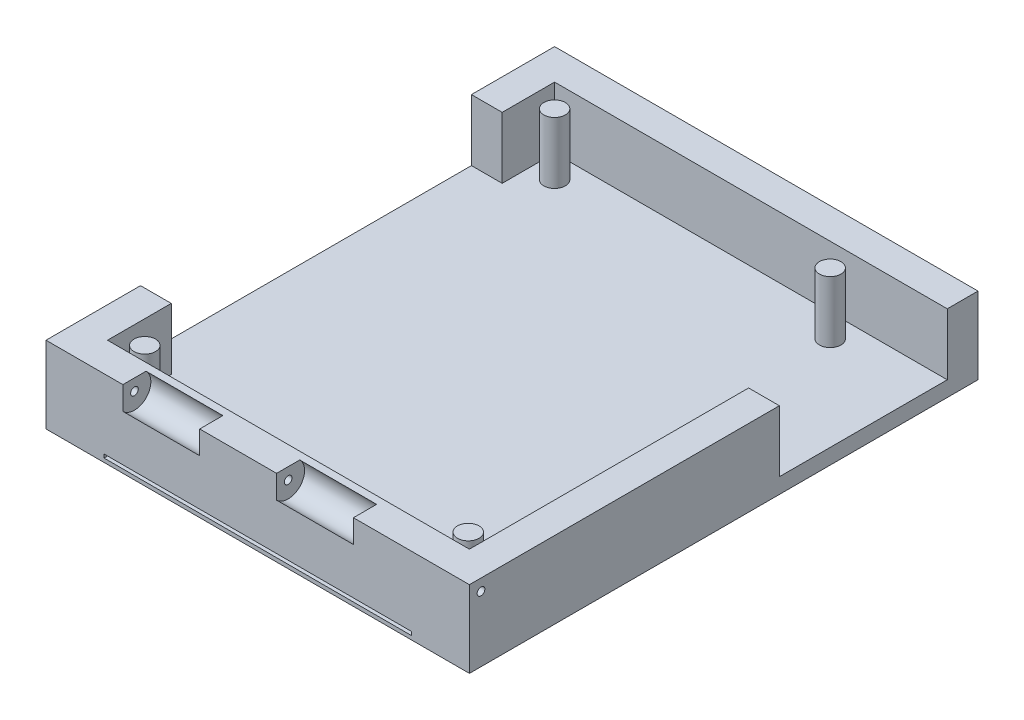
ISO-10303-21;
HEADER;
FILE_DESCRIPTION(('STEP AP214'),'2;1');
FILE_NAME('part.step','',(''),(''),'','','');
FILE_SCHEMA(('AUTOMOTIVE_DESIGN { 1 0 10303 214 1 1 1 1 }'));
ENDSEC;
DATA;
#1=APPLICATION_CONTEXT('core data for automotive mechanical design processes');
#2=APPLICATION_PROTOCOL_DEFINITION('international standard','automotive_design',2000,#1);
#3=PRODUCT_CONTEXT('',#1,'mechanical');
#4=PRODUCT('Part','Part','',(#3));
#5=PRODUCT_RELATED_PRODUCT_CATEGORY('part','',(#4));
#6=PRODUCT_DEFINITION_FORMATION('','',#4);
#7=PRODUCT_DEFINITION_CONTEXT('part definition',#1,'design');
#8=PRODUCT_DEFINITION('design','',#6,#7);
#9=PRODUCT_DEFINITION_SHAPE('','',#8);
#10=(LENGTH_UNIT() NAMED_UNIT(*) SI_UNIT(.MILLI.,.METRE.));
#11=(NAMED_UNIT(*) PLANE_ANGLE_UNIT() SI_UNIT($,.RADIAN.));
#12=(NAMED_UNIT(*) SI_UNIT($,.STERADIAN.) SOLID_ANGLE_UNIT());
#13=UNCERTAINTY_MEASURE_WITH_UNIT(LENGTH_MEASURE(1.E-05),#10,'distance_accuracy_value','');
#14=(GEOMETRIC_REPRESENTATION_CONTEXT(3) GLOBAL_UNCERTAINTY_ASSIGNED_CONTEXT((#13)) GLOBAL_UNIT_ASSIGNED_CONTEXT((#10,
#11,#12)) REPRESENTATION_CONTEXT('',''));
#15=CARTESIAN_POINT('',(0.,0.,0.));
#16=DIRECTION('',(0.,0.,1.));
#17=DIRECTION('',(1.,0.,0.));
#18=AXIS2_PLACEMENT_3D('',#15,#16,#17);
#19=CARTESIAN_POINT('',(0.,10.,-4.));
#20=DIRECTION('',(0.,0.,-1.));
#21=DIRECTION('',(-1.,0.,0.));
#22=AXIS2_PLACEMENT_3D('',#19,#20,#21);
#23=PLANE('',#22);
#24=DIRECTION('',(0.,-1.,0.));
#25=VECTOR('',#24,1.);
#26=CARTESIAN_POINT('',(43.54,0.,-4.00000000000001));
#27=LINE('',#26,#25);
#28=CARTESIAN_POINT('',(43.54,0.960570004327368,-4.00000000000001));
#29=VERTEX_POINT('',#28);
#30=CARTESIAN_POINT('',(43.54,0.496763339663532,-4.00000000000001));
#31=VERTEX_POINT('',#30);
#32=EDGE_CURVE('E65',#29,#31,#27,.T.);
#33=ORIENTED_EDGE('',*,*,#32,.F.);
#34=DIRECTION('',(1.,0.,0.));
#35=VECTOR('',#34,1.);
#36=CARTESIAN_POINT('',(0.,0.960570004327371,-4.));
#37=LINE('',#36,#35);
#38=CARTESIAN_POINT('',(3.55,0.96057000432737,-4.));
#39=VERTEX_POINT('',#38);
#40=EDGE_CURVE('E256',#39,#29,#37,.T.);
#41=ORIENTED_EDGE('',*,*,#40,.F.);
#42=DIRECTION('',(0.,1.,0.));
#43=VECTOR('',#42,1.);
#44=CARTESIAN_POINT('',(3.55,0.,-4.));
#45=LINE('',#44,#43);
#46=CARTESIAN_POINT('',(3.55,0.496763339663532,-4.));
#47=VERTEX_POINT('',#46);
#48=EDGE_CURVE('E260',#47,#39,#45,.T.);
#49=ORIENTED_EDGE('',*,*,#48,.F.);
#50=DIRECTION('',(-1.,0.,0.));
#51=VECTOR('',#50,1.);
#52=CARTESIAN_POINT('',(0.,0.496763339663532,-4.));
#53=LINE('',#52,#51);
#54=EDGE_CURVE('E269',#31,#47,#53,.T.);
#55=ORIENTED_EDGE('',*,*,#54,.F.);
#56=EDGE_LOOP('',(#33,#41,#49,#55));
#57=FACE_BOUND('',#56,.T.);
#58=DIRECTION('',(1.,0.,0.));
#59=VECTOR('',#58,1.);
#60=CARTESIAN_POINT('',(0.,0.,-4.));
#61=LINE('',#60,#59);
#62=CARTESIAN_POINT('',(-4.,0.,-4.));
#63=VERTEX_POINT('',#62);
#64=CARTESIAN_POINT('',(51.09,0.,-4.00000000000002));
#65=VERTEX_POINT('',#64);
#66=EDGE_CURVE('E486',#63,#65,#61,.T.);
#67=ORIENTED_EDGE('',*,*,#66,.F.);
#68=DIRECTION('',(0.,-1.,0.));
#69=VECTOR('',#68,1.);
#70=CARTESIAN_POINT('',(-4.,10.,-4.));
#71=LINE('',#70,#69);
#72=CARTESIAN_POINT('',(-4.,10.,-4.));
#73=VERTEX_POINT('',#72);
#74=EDGE_CURVE('E509',#73,#63,#71,.T.);
#75=ORIENTED_EDGE('',*,*,#74,.F.);
#76=DIRECTION('',(1.,0.,0.));
#77=VECTOR('',#76,1.);
#78=CARTESIAN_POINT('',(0.,10.,-4.));
#79=LINE('',#78,#77);
#80=CARTESIAN_POINT('',(51.09,10.,-4.00000000000002));
#81=VERTEX_POINT('',#80);
#82=EDGE_CURVE('E454',#73,#81,#79,.T.);
#83=ORIENTED_EDGE('',*,*,#82,.T.);
#84=DIRECTION('',(0.,-1.,0.));
#85=VECTOR('',#84,1.);
#86=CARTESIAN_POINT('',(51.09,10.,-4.00000000000002));
#87=LINE('',#86,#85);
#88=EDGE_CURVE('E512',#81,#65,#87,.T.);
#89=ORIENTED_EDGE('',*,*,#88,.T.);
#90=EDGE_LOOP('',(#67,#75,#83,#89));
#91=FACE_BOUND('',#90,.T.);
#92=DIRECTION('',(-1.,0.,0.));
#93=VECTOR('',#92,1.);
#94=CARTESIAN_POINT('',(0.,6.47627060246801,-4.));
#95=LINE('',#94,#93);
#96=CARTESIAN_POINT('',(28.54,6.47627060246801,-4.00000000000001));
#97=VERTEX_POINT('',#96);
#98=CARTESIAN_POINT('',(18.54,6.47627060246801,-4.00000000000001));
#99=VERTEX_POINT('',#98);
#100=EDGE_CURVE('E304',#97,#99,#95,.T.);
#101=ORIENTED_EDGE('',*,*,#100,.F.);
#102=DIRECTION('',(0.,-1.,0.));
#103=VECTOR('',#102,1.);
#104=CARTESIAN_POINT('',(28.54,0.,-4.00000000000001));
#105=LINE('',#104,#103);
#106=CARTESIAN_POINT('',(28.54,7.51319703194659,-4.00000000000001));
#107=VERTEX_POINT('',#106);
#108=EDGE_CURVE('E278',#107,#97,#105,.T.);
#109=ORIENTED_EDGE('',*,*,#108,.F.);
#110=DIRECTION('',(-1.,0.,0.));
#111=VECTOR('',#110,1.);
#112=CARTESIAN_POINT('',(0.,7.51319703194659,-4.));
#113=LINE('',#112,#111);
#114=CARTESIAN_POINT('',(18.54,7.51319703194659,-4.00000000000001));
#115=VERTEX_POINT('',#114);
#116=EDGE_CURVE('E289',#107,#115,#113,.T.);
#117=ORIENTED_EDGE('',*,*,#116,.T.);
#118=DIRECTION('',(0.,-1.,0.));
#119=VECTOR('',#118,1.);
#120=CARTESIAN_POINT('',(18.54,0.,-4.00000000000001));
#121=LINE('',#120,#119);
#122=EDGE_CURVE('E308',#115,#99,#121,.T.);
#123=ORIENTED_EDGE('',*,*,#122,.T.);
#124=EDGE_LOOP('',(#101,#109,#117,#123));
#125=FACE_BOUND('',#124,.T.);
#126=ADVANCED_FACE('F49',(#57,#91,#125),#23,.T.);
#127=CARTESIAN_POINT('',(-4.,8.48912292740961,60.6623709498255));
#128=DIRECTION('',(1.,0.,0.));
#129=DIRECTION('',(0.,0.,-1.));
#130=AXIS2_PLACEMENT_3D('',#127,#128,#129);
#131=CYLINDRICAL_SURFACE('',#130,0.499999999999999);
#132=CARTESIAN_POINT('',(16.,8.48912292740961,60.6623709498255));
#133=DIRECTION('',(1.,0.,0.));
#134=DIRECTION('',(0.,0.,-1.));
#135=AXIS2_PLACEMENT_3D('',#132,#133,#134);
#136=CIRCLE('',#135,0.499999999999999);
#137=CARTESIAN_POINT('',(16.,8.48912292740961,60.1623709498255));
#138=VERTEX_POINT('',#137);
#139=EDGE_CURVE('E369',#138,#138,#136,.F.);
#140=ORIENTED_EDGE('',*,*,#139,.T.);
#141=EDGE_LOOP('',(#140));
#142=FACE_BOUND('',#141,.T.);
#143=CARTESIAN_POINT('',(26.,8.48912292740961,60.6623709498255));
#144=DIRECTION('',(1.,0.,0.));
#145=DIRECTION('',(0.,0.,-1.));
#146=AXIS2_PLACEMENT_3D('',#143,#144,#145);
#147=CIRCLE('',#146,0.499999999999999);
#148=CARTESIAN_POINT('',(26.,8.48912292740961,60.1623709498255));
#149=VERTEX_POINT('',#148);
#150=EDGE_CURVE('E333',#149,#149,#147,.F.);
#151=ORIENTED_EDGE('',*,*,#150,.F.);
#152=EDGE_LOOP('',(#151));
#153=FACE_BOUND('',#152,.T.);
#154=ADVANCED_FACE('F671',(#142,#153),#131,.F.);
#155=CARTESIAN_POINT('',(-4.,8.48912292740961,60.6623709498255));
#156=DIRECTION('',(1.,0.,0.));
#157=DIRECTION('',(0.,0.,-1.));
#158=AXIS2_PLACEMENT_3D('',#155,#156,#157);
#159=CIRCLE('',#158,0.499999999999999);
#160=CARTESIAN_POINT('',(-4.,8.48912292740961,60.1623709498255));
#161=VERTEX_POINT('',#160);
#162=EDGE_CURVE('E381',#161,#161,#159,.T.);
#163=ORIENTED_EDGE('',*,*,#162,.F.);
#164=EDGE_LOOP('',(#163));
#165=FACE_BOUND('',#164,.T.);
#166=CARTESIAN_POINT('',(6.00000000000001,8.48912292740961,60.6623709498255));
#167=DIRECTION('',(1.,0.,0.));
#168=DIRECTION('',(0.,0.,-1.));
#169=AXIS2_PLACEMENT_3D('',#166,#167,#168);
#170=CIRCLE('',#169,0.499999999999999);
#171=CARTESIAN_POINT('',(6.00000000000001,8.48912292740961,60.1623709498255));
#172=VERTEX_POINT('',#171);
#173=EDGE_CURVE('E359',#172,#172,#170,.F.);
#174=ORIENTED_EDGE('',*,*,#173,.F.);
#175=EDGE_LOOP('',(#174));
#176=FACE_BOUND('',#175,.T.);
#177=ADVANCED_FACE('F679',(#165,#176),#131,.F.);
#178=CARTESIAN_POINT('',(0.,10.,0.));
#179=DIRECTION('',(1.,0.,0.));
#180=DIRECTION('',(0.,0.,-1.));
#181=AXIS2_PLACEMENT_3D('',#178,#179,#180);
#182=PLANE('',#181);
#183=DIRECTION('',(0.,0.,1.));
#184=VECTOR('',#183,1.);
#185=CARTESIAN_POINT('',(0.,10.,0.));
#186=LINE('',#185,#184);
#187=CARTESIAN_POINT('',(0.,10.,0.));
#188=VERTEX_POINT('',#187);
#189=CARTESIAN_POINT('',(0.,10.,6.81881241842648));
#190=VERTEX_POINT('',#189);
#191=EDGE_CURVE('E471',#188,#190,#186,.T.);
#192=ORIENTED_EDGE('',*,*,#191,.T.);
#193=DIRECTION('',(0.,-1.,0.));
#194=VECTOR('',#193,1.);
#195=CARTESIAN_POINT('',(0.,10.,6.81881241842648));
#196=LINE('',#195,#194);
#197=CARTESIAN_POINT('',(0.,2.,6.81881241842648));
#198=VERTEX_POINT('',#197);
#199=EDGE_CURVE('E412',#190,#198,#196,.T.);
#200=ORIENTED_EDGE('',*,*,#199,.T.);
#201=DIRECTION('',(0.,0.,1.));
#202=VECTOR('',#201,1.);
#203=CARTESIAN_POINT('',(0.,2.,0.));
#204=LINE('',#203,#202);
#205=CARTESIAN_POINT('',(0.,2.,0.));
#206=VERTEX_POINT('',#205);
#207=EDGE_CURVE('E537',#206,#198,#204,.T.);
#208=ORIENTED_EDGE('',*,*,#207,.F.);
#209=DIRECTION('',(0.,-1.,0.));
#210=VECTOR('',#209,1.);
#211=CARTESIAN_POINT('',(0.,10.,0.));
#212=LINE('',#211,#210);
#213=EDGE_CURVE('E493',#188,#206,#212,.T.);
#214=ORIENTED_EDGE('',*,*,#213,.F.);
#215=EDGE_LOOP('',(#192,#200,#208,#214));
#216=FACE_BOUND('',#215,.T.);
#217=ADVANCED_FACE('F647',(#216),#182,.T.);
#218=CARTESIAN_POINT('',(0.,10.,0.));
#219=DIRECTION('',(0.,1.,0.));
#220=DIRECTION('',(0.,0.,1.));
#221=AXIS2_PLACEMENT_3D('',#218,#219,#220);
#222=PLANE('',#221);
#223=DIRECTION('',(0.,0.,1.));
#224=VECTOR('',#223,1.);
#225=CARTESIAN_POINT('',(-4.,10.,0.));
#226=LINE('',#225,#224);
#227=CARTESIAN_POINT('',(-4.,10.,6.81881241842648));
#228=VERTEX_POINT('',#227);
#229=EDGE_CURVE('E459',#73,#228,#226,.T.);
#230=ORIENTED_EDGE('',*,*,#229,.T.);
#231=DIRECTION('',(1.,0.,0.));
#232=VECTOR('',#231,1.);
#233=CARTESIAN_POINT('',(-4.,10.,6.81881241842648));
#234=LINE('',#233,#232);
#235=EDGE_CURVE('E394',#228,#190,#234,.T.);
#236=ORIENTED_EDGE('',*,*,#235,.T.);
#237=ORIENTED_EDGE('',*,*,#191,.F.);
#238=DIRECTION('',(1.,0.,0.));
#239=VECTOR('',#238,1.);
#240=CARTESIAN_POINT('',(0.,10.,0.));
#241=LINE('',#240,#239);
#242=CARTESIAN_POINT('',(51.09,10.,0.));
#243=VERTEX_POINT('',#242);
#244=EDGE_CURVE('E475',#188,#243,#241,.T.);
#245=ORIENTED_EDGE('',*,*,#244,.T.);
#246=DIRECTION('',(0.,0.,1.));
#247=VECTOR('',#246,1.);
#248=CARTESIAN_POINT('',(51.09,10.,0.));
#249=LINE('',#248,#247);
#250=EDGE_CURVE('E450',#81,#243,#249,.T.);
#251=ORIENTED_EDGE('',*,*,#250,.F.);
#252=ORIENTED_EDGE('',*,*,#82,.F.);
#253=EDGE_LOOP('',(#230,#236,#237,#245,#251,#252));
#254=FACE_BOUND('',#253,.T.);
#255=ADVANCED_FACE('F651',(#254),#222,.T.);
#256=CARTESIAN_POINT('',(0.,2.,0.));
#257=DIRECTION('',(0.,-1.,0.));
#258=DIRECTION('',(0.,0.,-1.));
#259=AXIS2_PLACEMENT_3D('',#256,#257,#258);
#260=PLANE('',#259);
#261=DIRECTION('',(1.,0.,0.));
#262=VECTOR('',#261,1.);
#263=CARTESIAN_POINT('',(-3.99999999999999,2.,49.872624267247));
#264=LINE('',#263,#262);
#265=CARTESIAN_POINT('',(-3.99999999999999,2.,49.872624267247));
#266=VERTEX_POINT('',#265);
#267=CARTESIAN_POINT('',(0.,2.,49.872624267247));
#268=VERTEX_POINT('',#267);
#269=EDGE_CURVE('E389',#266,#268,#264,.T.);
#270=ORIENTED_EDGE('',*,*,#269,.T.);
#271=CARTESIAN_POINT('',(0.,2.,58.17));
#272=VERTEX_POINT('',#271);
#273=EDGE_CURVE('E536',#268,#272,#204,.T.);
#274=ORIENTED_EDGE('',*,*,#273,.T.);
#275=DIRECTION('',(1.,0.,0.));
#276=VECTOR('',#275,1.);
#277=CARTESIAN_POINT('',(0.,2.,58.17));
#278=LINE('',#277,#276);
#279=CARTESIAN_POINT('',(47.09,2.,58.17));
#280=VERTEX_POINT('',#279);
#281=EDGE_CURVE('E541',#272,#280,#278,.T.);
#282=ORIENTED_EDGE('',*,*,#281,.T.);
#283=DIRECTION('',(0.,0.,-1.));
#284=VECTOR('',#283,1.);
#285=CARTESIAN_POINT('',(47.09,2.,0.));
#286=LINE('',#285,#284);
#287=CARTESIAN_POINT('',(47.09,2.,21.843851608234));
#288=VERTEX_POINT('',#287);
#289=EDGE_CURVE('E545',#280,#288,#286,.T.);
#290=ORIENTED_EDGE('',*,*,#289,.T.);
#291=DIRECTION('',(1.,0.,0.));
#292=VECTOR('',#291,1.);
#293=CARTESIAN_POINT('',(47.09,2.,21.843851608234));
#294=LINE('',#293,#292);
#295=CARTESIAN_POINT('',(51.09,2.,21.843851608234));
#296=VERTEX_POINT('',#295);
#297=EDGE_CURVE('E426',#288,#296,#294,.T.);
#298=ORIENTED_EDGE('',*,*,#297,.T.);
#299=DIRECTION('',(0.,0.,1.));
#300=VECTOR('',#299,1.);
#301=CARTESIAN_POINT('',(51.09,2.,0.));
#302=LINE('',#301,#300);
#303=CARTESIAN_POINT('',(51.09,2.,0.));
#304=VERTEX_POINT('',#303);
#305=EDGE_CURVE('E429',#304,#296,#302,.T.);
#306=ORIENTED_EDGE('',*,*,#305,.F.);
#307=DIRECTION('',(-1.,0.,0.));
#308=VECTOR('',#307,1.);
#309=CARTESIAN_POINT('',(0.,2.,0.));
#310=LINE('',#309,#308);
#311=EDGE_CURVE('E532',#304,#206,#310,.T.);
#312=ORIENTED_EDGE('',*,*,#311,.T.);
#313=ORIENTED_EDGE('',*,*,#207,.T.);
#314=DIRECTION('',(1.,0.,0.));
#315=VECTOR('',#314,1.);
#316=CARTESIAN_POINT('',(-4.,2.,6.81881241842648));
#317=LINE('',#316,#315);
#318=CARTESIAN_POINT('',(-4.,2.,6.81881241842648));
#319=VERTEX_POINT('',#318);
#320=EDGE_CURVE('E393',#319,#198,#317,.T.);
#321=ORIENTED_EDGE('',*,*,#320,.F.);
#322=DIRECTION('',(0.,0.,1.));
#323=VECTOR('',#322,1.);
#324=CARTESIAN_POINT('',(-4.,2.,6.81881241842648));
#325=LINE('',#324,#323);
#326=EDGE_CURVE('E397',#319,#266,#325,.T.);
#327=ORIENTED_EDGE('',*,*,#326,.T.);
#328=EDGE_LOOP('',(#270,#274,#282,#290,#298,#306,#312,#313,#321,#327));
#329=FACE_BOUND('',#328,.T.);
#330=CARTESIAN_POINT('',(3.,2.,3.));
#331=DIRECTION('',(0.,-1.,0.));
#332=DIRECTION('',(0.,0.,-1.));
#333=AXIS2_PLACEMENT_3D('',#330,#331,#332);
#334=CIRCLE('',#333,1.4);
#335=CARTESIAN_POINT('',(3.,2.,1.6));
#336=VERTEX_POINT('',#335);
#337=EDGE_CURVE('E561',#336,#336,#334,.F.);
#338=ORIENTED_EDGE('',*,*,#337,.F.);
#339=EDGE_LOOP('',(#338));
#340=FACE_BOUND('',#339,.T.);
#341=CARTESIAN_POINT('',(38.86,2.,3.));
#342=DIRECTION('',(0.,-1.,0.));
#343=DIRECTION('',(0.,0.,-1.));
#344=AXIS2_PLACEMENT_3D('',#341,#342,#343);
#345=CIRCLE('',#344,1.4);
#346=CARTESIAN_POINT('',(38.86,2.,1.6));
#347=VERTEX_POINT('',#346);
#348=EDGE_CURVE('E557',#347,#347,#345,.F.);
#349=ORIENTED_EDGE('',*,*,#348,.F.);
#350=EDGE_LOOP('',(#349));
#351=FACE_BOUND('',#350,.T.);
#352=CARTESIAN_POINT('',(45.09,2.,56.32));
#353=DIRECTION('',(0.,-1.,0.));
#354=DIRECTION('',(0.,0.,-1.));
#355=AXIS2_PLACEMENT_3D('',#352,#353,#354);
#356=CIRCLE('',#355,1.4);
#357=CARTESIAN_POINT('',(45.09,2.,54.92));
#358=VERTEX_POINT('',#357);
#359=EDGE_CURVE('E553',#358,#358,#356,.F.);
#360=ORIENTED_EDGE('',*,*,#359,.F.);
#361=EDGE_LOOP('',(#360));
#362=FACE_BOUND('',#361,.T.);
#363=CARTESIAN_POINT('',(3.00000000000001,2.,56.32));
#364=DIRECTION('',(0.,-1.,0.));
#365=DIRECTION('',(0.,0.,-1.));
#366=AXIS2_PLACEMENT_3D('',#363,#364,#365);
#367=CIRCLE('',#366,1.4);
#368=CARTESIAN_POINT('',(3.00000000000001,2.,54.92));
#369=VERTEX_POINT('',#368);
#370=EDGE_CURVE('E549',#369,#369,#367,.F.);
#371=ORIENTED_EDGE('',*,*,#370,.F.);
#372=EDGE_LOOP('',(#371));
#373=FACE_BOUND('',#372,.T.);
#374=ADVANCED_FACE('F615',(#329,#340,#351,#362,#373),#260,.F.);
#375=CARTESIAN_POINT('',(3.00000000000001,10.,56.32));
#376=DIRECTION('',(0.,-1.,0.));
#377=DIRECTION('',(0.,0.,-1.));
#378=AXIS2_PLACEMENT_3D('',#375,#376,#377);
#379=CYLINDRICAL_SURFACE('',#378,1.4);
#380=CARTESIAN_POINT('',(3.00000000000001,10.,56.32));
#381=DIRECTION('',(0.,1.,0.));
#382=DIRECTION('',(0.,0.,1.));
#383=AXIS2_PLACEMENT_3D('',#380,#381,#382);
#384=CIRCLE('',#383,1.4);
#385=CARTESIAN_POINT('',(3.00000000000001,10.,57.72));
#386=VERTEX_POINT('',#385);
#387=EDGE_CURVE('E528',#386,#386,#384,.T.);
#388=ORIENTED_EDGE('',*,*,#387,.F.);
#389=EDGE_LOOP('',(#388));
#390=FACE_BOUND('',#389,.T.);
#391=ORIENTED_EDGE('',*,*,#370,.T.);
#392=EDGE_LOOP('',(#391));
#393=FACE_BOUND('',#392,.T.);
#394=ADVANCED_FACE('F717',(#390,#393),#379,.T.);
#395=CARTESIAN_POINT('',(0.,10.,0.));
#396=DIRECTION('',(0.,1.,0.));
#397=DIRECTION('',(0.,0.,1.));
#398=AXIS2_PLACEMENT_3D('',#395,#396,#397);
#399=PLANE('',#398);
#400=ORIENTED_EDGE('',*,*,#387,.T.);
#401=EDGE_LOOP('',(#400));
#402=FACE_BOUND('',#401,.T.);
#403=ADVANCED_FACE('F710',(#402),#399,.T.);
#404=CARTESIAN_POINT('',(45.09,10.,56.32));
#405=DIRECTION('',(0.,-1.,0.));
#406=DIRECTION('',(0.,0.,-1.));
#407=AXIS2_PLACEMENT_3D('',#404,#405,#406);
#408=CYLINDRICAL_SURFACE('',#407,1.4);
#409=CARTESIAN_POINT('',(45.09,10.,56.32));
#410=DIRECTION('',(0.,1.,0.));
#411=DIRECTION('',(0.,0.,1.));
#412=AXIS2_PLACEMENT_3D('',#409,#410,#411);
#413=CIRCLE('',#412,1.4);
#414=CARTESIAN_POINT('',(45.09,10.,57.72));
#415=VERTEX_POINT('',#414);
#416=EDGE_CURVE('E524',#415,#415,#413,.T.);
#417=ORIENTED_EDGE('',*,*,#416,.F.);
#418=EDGE_LOOP('',(#417));
#419=FACE_BOUND('',#418,.T.);
#420=ORIENTED_EDGE('',*,*,#359,.T.);
#421=EDGE_LOOP('',(#420));
#422=FACE_BOUND('',#421,.T.);
#423=ADVANCED_FACE('F707',(#419,#422),#408,.T.);
#424=CARTESIAN_POINT('',(0.,10.,0.));
#425=DIRECTION('',(0.,1.,0.));
#426=DIRECTION('',(0.,0.,1.));
#427=AXIS2_PLACEMENT_3D('',#424,#425,#426);
#428=PLANE('',#427);
#429=ORIENTED_EDGE('',*,*,#416,.T.);
#430=EDGE_LOOP('',(#429));
#431=FACE_BOUND('',#430,.T.);
#432=ADVANCED_FACE('F702',(#431),#428,.T.);
#433=CARTESIAN_POINT('',(38.86,10.,3.));
#434=DIRECTION('',(0.,-1.,0.));
#435=DIRECTION('',(0.,0.,-1.));
#436=AXIS2_PLACEMENT_3D('',#433,#434,#435);
#437=CYLINDRICAL_SURFACE('',#436,1.4);
#438=CARTESIAN_POINT('',(38.86,10.,3.));
#439=DIRECTION('',(0.,1.,0.));
#440=DIRECTION('',(0.,0.,1.));
#441=AXIS2_PLACEMENT_3D('',#438,#439,#440);
#442=CIRCLE('',#441,1.4);
#443=CARTESIAN_POINT('',(38.86,10.,4.4));
#444=VERTEX_POINT('',#443);
#445=EDGE_CURVE('E520',#444,#444,#442,.T.);
#446=ORIENTED_EDGE('',*,*,#445,.F.);
#447=EDGE_LOOP('',(#446));
#448=FACE_BOUND('',#447,.T.);
#449=ORIENTED_EDGE('',*,*,#348,.T.);
#450=EDGE_LOOP('',(#449));
#451=FACE_BOUND('',#450,.T.);
#452=ADVANCED_FACE('F699',(#448,#451),#437,.T.);
#453=CARTESIAN_POINT('',(0.,10.,0.));
#454=DIRECTION('',(0.,1.,0.));
#455=DIRECTION('',(0.,0.,1.));
#456=AXIS2_PLACEMENT_3D('',#453,#454,#455);
#457=PLANE('',#456);
#458=ORIENTED_EDGE('',*,*,#445,.T.);
#459=EDGE_LOOP('',(#458));
#460=FACE_BOUND('',#459,.T.);
#461=ADVANCED_FACE('F694',(#460),#457,.T.);
#462=CARTESIAN_POINT('',(3.,10.,3.));
#463=DIRECTION('',(0.,-1.,0.));
#464=DIRECTION('',(0.,0.,-1.));
#465=AXIS2_PLACEMENT_3D('',#462,#463,#464);
#466=CYLINDRICAL_SURFACE('',#465,1.4);
#467=ORIENTED_EDGE('',*,*,#337,.T.);
#468=EDGE_LOOP('',(#467));
#469=FACE_BOUND('',#468,.T.);
#470=CARTESIAN_POINT('',(3.,10.,3.));
#471=DIRECTION('',(0.,1.,0.));
#472=DIRECTION('',(0.,0.,1.));
#473=AXIS2_PLACEMENT_3D('',#470,#471,#472);
#474=CIRCLE('',#473,1.4);
#475=CARTESIAN_POINT('',(3.,10.,4.4));
#476=VERTEX_POINT('',#475);
#477=EDGE_CURVE('E505',#476,#476,#474,.T.);
#478=ORIENTED_EDGE('',*,*,#477,.F.);
#479=EDGE_LOOP('',(#478));
#480=FACE_BOUND('',#479,.T.);
#481=ADVANCED_FACE('F690',(#469,#480),#466,.T.);
#482=CARTESIAN_POINT('',(0.,10.,0.));
#483=DIRECTION('',(0.,1.,0.));
#484=DIRECTION('',(0.,0.,1.));
#485=AXIS2_PLACEMENT_3D('',#482,#483,#484);
#486=PLANE('',#485);
#487=ORIENTED_EDGE('',*,*,#477,.T.);
#488=EDGE_LOOP('',(#487));
#489=FACE_BOUND('',#488,.T.);
#490=ADVANCED_FACE('F693',(#489),#486,.T.);
#491=CARTESIAN_POINT('',(47.09,10.,0.));
#492=DIRECTION('',(1.,0.,0.));
#493=DIRECTION('',(0.,0.,-1.));
#494=AXIS2_PLACEMENT_3D('',#491,#492,#493);
#495=PLANE('',#494);
#496=DIRECTION('',(0.,0.,1.));
#497=VECTOR('',#496,1.);
#498=CARTESIAN_POINT('',(47.09,10.,0.));
#499=LINE('',#498,#497);
#500=CARTESIAN_POINT('',(47.09,10.,21.843851608234));
#501=VERTEX_POINT('',#500);
#502=CARTESIAN_POINT('',(47.09,10.,58.17));
#503=VERTEX_POINT('',#502);
#504=EDGE_CURVE('E463',#501,#503,#499,.T.);
#505=ORIENTED_EDGE('',*,*,#504,.F.);
#506=DIRECTION('',(0.,1.,0.));
#507=VECTOR('',#506,1.);
#508=CARTESIAN_POINT('',(47.09,2.,21.843851608234));
#509=LINE('',#508,#507);
#510=EDGE_CURVE('E419',#288,#501,#509,.T.);
#511=ORIENTED_EDGE('',*,*,#510,.F.);
#512=ORIENTED_EDGE('',*,*,#289,.F.);
#513=DIRECTION('',(0.,-1.,0.));
#514=VECTOR('',#513,1.);
#515=CARTESIAN_POINT('',(47.09,10.,58.17));
#516=LINE('',#515,#514);
#517=EDGE_CURVE('E501',#503,#280,#516,.T.);
#518=ORIENTED_EDGE('',*,*,#517,.F.);
#519=EDGE_LOOP('',(#505,#511,#512,#518));
#520=FACE_BOUND('',#519,.T.);
#521=ADVANCED_FACE('F632',(#520),#495,.F.);
#522=CARTESIAN_POINT('',(0.,10.,58.17));
#523=DIRECTION('',(0.,0.,-1.));
#524=DIRECTION('',(-1.,0.,0.));
#525=AXIS2_PLACEMENT_3D('',#522,#523,#524);
#526=PLANE('',#525);
#527=ORIENTED_EDGE('',*,*,#281,.F.);
#528=DIRECTION('',(0.,-1.,0.));
#529=VECTOR('',#528,1.);
#530=CARTESIAN_POINT('',(0.,10.,58.17));
#531=LINE('',#530,#529);
#532=CARTESIAN_POINT('',(0.,10.,58.17));
#533=VERTEX_POINT('',#532);
#534=EDGE_CURVE('E496',#533,#272,#531,.T.);
#535=ORIENTED_EDGE('',*,*,#534,.F.);
#536=DIRECTION('',(1.,0.,0.));
#537=VECTOR('',#536,1.);
#538=CARTESIAN_POINT('',(0.,10.,58.17));
#539=LINE('',#538,#537);
#540=EDGE_CURVE('E466',#533,#503,#539,.T.);
#541=ORIENTED_EDGE('',*,*,#540,.T.);
#542=ORIENTED_EDGE('',*,*,#517,.T.);
#543=EDGE_LOOP('',(#527,#535,#541,#542));
#544=FACE_BOUND('',#543,.T.);
#545=ADVANCED_FACE('F621',(#544),#526,.T.);
#546=DIRECTION('',(0.,-1.,0.));
#547=VECTOR('',#546,1.);
#548=CARTESIAN_POINT('',(0.,10.,49.872624267247));
#549=LINE('',#548,#547);
#550=CARTESIAN_POINT('',(0.,10.,49.872624267247));
#551=VERTEX_POINT('',#550);
#552=EDGE_CURVE('E439',#551,#268,#549,.T.);
#553=ORIENTED_EDGE('',*,*,#552,.F.);
#554=EDGE_CURVE('E470',#551,#533,#186,.T.);
#555=ORIENTED_EDGE('',*,*,#554,.T.);
#556=ORIENTED_EDGE('',*,*,#534,.T.);
#557=ORIENTED_EDGE('',*,*,#273,.F.);
#558=EDGE_LOOP('',(#553,#555,#556,#557));
#559=FACE_BOUND('',#558,.T.);
#560=ADVANCED_FACE('F624',(#559),#182,.T.);
#561=CARTESIAN_POINT('',(0.,10.,0.));
#562=DIRECTION('',(0.,0.,-1.));
#563=DIRECTION('',(-1.,0.,0.));
#564=AXIS2_PLACEMENT_3D('',#561,#562,#563);
#565=PLANE('',#564);
#566=ORIENTED_EDGE('',*,*,#213,.T.);
#567=ORIENTED_EDGE('',*,*,#311,.F.);
#568=DIRECTION('',(0.,1.,0.));
#569=VECTOR('',#568,1.);
#570=CARTESIAN_POINT('',(51.09,2.,0.));
#571=LINE('',#570,#569);
#572=EDGE_CURVE('E422',#304,#243,#571,.T.);
#573=ORIENTED_EDGE('',*,*,#572,.T.);
#574=ORIENTED_EDGE('',*,*,#244,.F.);
#575=EDGE_LOOP('',(#566,#567,#573,#574));
#576=FACE_BOUND('',#575,.T.);
#577=ADVANCED_FACE('F641',(#576),#565,.F.);
#578=CARTESIAN_POINT('',(0.,10.,62.17));
#579=DIRECTION('',(0.,0.,-1.));
#580=DIRECTION('',(-1.,0.,0.));
#581=AXIS2_PLACEMENT_3D('',#578,#579,#580);
#582=PLANE('',#581);
#583=DIRECTION('',(1.,0.,0.));
#584=VECTOR('',#583,1.);
#585=CARTESIAN_POINT('',(0.,0.960570004327371,62.17));
#586=LINE('',#585,#584);
#587=CARTESIAN_POINT('',(3.55000000000002,0.96057000432737,62.17));
#588=VERTEX_POINT('',#587);
#589=CARTESIAN_POINT('',(43.54,0.960570004327368,62.17));
#590=VERTEX_POINT('',#589);
#591=EDGE_CURVE('E244',#588,#590,#586,.T.);
#592=ORIENTED_EDGE('',*,*,#591,.T.);
#593=DIRECTION('',(0.,-1.,0.));
#594=VECTOR('',#593,1.);
#595=CARTESIAN_POINT('',(43.54,0.,62.17));
#596=LINE('',#595,#594);
#597=CARTESIAN_POINT('',(43.54,0.496763339663532,62.17));
#598=VERTEX_POINT('',#597);
#599=EDGE_CURVE('E237',#590,#598,#596,.T.);
#600=ORIENTED_EDGE('',*,*,#599,.T.);
#601=DIRECTION('',(-1.,0.,0.));
#602=VECTOR('',#601,1.);
#603=CARTESIAN_POINT('',(0.,0.496763339663532,62.17));
#604=LINE('',#603,#602);
#605=CARTESIAN_POINT('',(3.55,0.496763339663532,62.17));
#606=VERTEX_POINT('',#605);
#607=EDGE_CURVE('E247',#598,#606,#604,.T.);
#608=ORIENTED_EDGE('',*,*,#607,.T.);
#609=DIRECTION('',(0.,1.,0.));
#610=VECTOR('',#609,1.);
#611=CARTESIAN_POINT('',(3.55000000000002,0.,62.17));
#612=LINE('',#611,#610);
#613=EDGE_CURVE('E73',#606,#588,#612,.T.);
#614=ORIENTED_EDGE('',*,*,#613,.T.);
#615=EDGE_LOOP('',(#592,#600,#608,#614));
#616=FACE_BOUND('',#615,.T.);
#617=DIRECTION('',(1.,0.,0.));
#618=VECTOR('',#617,1.);
#619=CARTESIAN_POINT('',(0.,10.,62.17));
#620=LINE('',#619,#618);
#621=CARTESIAN_POINT('',(36.,10.,62.17));
#622=VERTEX_POINT('',#621);
#623=CARTESIAN_POINT('',(51.09,10.,62.17));
#624=VERTEX_POINT('',#623);
#625=EDGE_CURVE('E449',#622,#624,#620,.T.);
#626=ORIENTED_EDGE('',*,*,#625,.F.);
#627=DIRECTION('',(0.,-1.,0.));
#628=VECTOR('',#627,1.);
#629=CARTESIAN_POINT('',(36.,10.,62.17));
#630=LINE('',#629,#628);
#631=CARTESIAN_POINT('',(36.,6.97824585481922,62.17));
#632=VERTEX_POINT('',#631);
#633=EDGE_CURVE('E347',#622,#632,#630,.T.);
#634=ORIENTED_EDGE('',*,*,#633,.T.);
#635=DIRECTION('',(-1.,0.,0.));
#636=VECTOR('',#635,1.);
#637=CARTESIAN_POINT('',(36.,6.97824585481922,62.17));
#638=LINE('',#637,#636);
#639=CARTESIAN_POINT('',(26.,6.97824585481922,62.17));
#640=VERTEX_POINT('',#639);
#641=EDGE_CURVE('E351',#640,#632,#638,.F.);
#642=ORIENTED_EDGE('',*,*,#641,.F.);
#643=DIRECTION('',(0.,-1.,0.));
#644=VECTOR('',#643,1.);
#645=CARTESIAN_POINT('',(26.,10.,62.17));
#646=LINE('',#645,#644);
#647=CARTESIAN_POINT('',(26.,10.,62.17));
#648=VERTEX_POINT('',#647);
#649=EDGE_CURVE('E340',#648,#640,#646,.T.);
#650=ORIENTED_EDGE('',*,*,#649,.F.);
#651=CARTESIAN_POINT('',(16.,10.,62.17));
#652=VERTEX_POINT('',#651);
#653=EDGE_CURVE('E448',#652,#648,#620,.T.);
#654=ORIENTED_EDGE('',*,*,#653,.F.);
#655=DIRECTION('',(0.,-1.,0.));
#656=VECTOR('',#655,1.);
#657=CARTESIAN_POINT('',(16.,10.,62.17));
#658=LINE('',#657,#656);
#659=CARTESIAN_POINT('',(16.,6.97824585481921,62.17));
#660=VERTEX_POINT('',#659);
#661=EDGE_CURVE('E373',#652,#660,#658,.T.);
#662=ORIENTED_EDGE('',*,*,#661,.T.);
#663=DIRECTION('',(-1.,0.,0.));
#664=VECTOR('',#663,1.);
#665=CARTESIAN_POINT('',(16.,6.97824585481921,62.17));
#666=LINE('',#665,#664);
#667=CARTESIAN_POINT('',(6.00000000000001,6.97824585481922,62.17));
#668=VERTEX_POINT('',#667);
#669=EDGE_CURVE('E377',#668,#660,#666,.F.);
#670=ORIENTED_EDGE('',*,*,#669,.F.);
#671=DIRECTION('',(0.,-1.,0.));
#672=VECTOR('',#671,1.);
#673=CARTESIAN_POINT('',(6.00000000000001,10.,62.17));
#674=LINE('',#673,#672);
#675=CARTESIAN_POINT('',(6.00000000000001,10.,62.17));
#676=VERTEX_POINT('',#675);
#677=EDGE_CURVE('E366',#676,#668,#674,.T.);
#678=ORIENTED_EDGE('',*,*,#677,.F.);
#679=CARTESIAN_POINT('',(-3.99999999999999,10.,62.17));
#680=VERTEX_POINT('',#679);
#681=EDGE_CURVE('E443',#680,#676,#620,.T.);
#682=ORIENTED_EDGE('',*,*,#681,.F.);
#683=DIRECTION('',(0.,-1.,0.));
#684=VECTOR('',#683,1.);
#685=CARTESIAN_POINT('',(-3.99999999999999,10.,62.17));
#686=LINE('',#685,#684);
#687=CARTESIAN_POINT('',(-3.99999999999999,0.,62.17));
#688=VERTEX_POINT('',#687);
#689=EDGE_CURVE('E478',#680,#688,#686,.T.);
#690=ORIENTED_EDGE('',*,*,#689,.T.);
#691=DIRECTION('',(1.,0.,0.));
#692=VECTOR('',#691,1.);
#693=CARTESIAN_POINT('',(0.,0.,62.17));
#694=LINE('',#693,#692);
#695=CARTESIAN_POINT('',(51.09,0.,62.17));
#696=VERTEX_POINT('',#695);
#697=EDGE_CURVE('E442',#688,#696,#694,.T.);
#698=ORIENTED_EDGE('',*,*,#697,.T.);
#699=DIRECTION('',(0.,-1.,0.));
#700=VECTOR('',#699,1.);
#701=CARTESIAN_POINT('',(51.09,10.,62.17));
#702=LINE('',#701,#700);
#703=EDGE_CURVE('E497',#624,#696,#702,.T.);
#704=ORIENTED_EDGE('',*,*,#703,.F.);
#705=EDGE_LOOP('',(#626,#634,#642,#650,#654,#662,#670,#678,#682,#690,#698,#704));
#706=FACE_BOUND('',#705,.T.);
#707=ADVANCED_FACE('F252',(#616,#706),#582,.F.);
#708=CARTESIAN_POINT('',(51.09,10.,0.));
#709=DIRECTION('',(1.,0.,0.));
#710=DIRECTION('',(0.,0.,-1.));
#711=AXIS2_PLACEMENT_3D('',#708,#709,#710);
#712=PLANE('',#711);
#713=CARTESIAN_POINT('',(51.09,8.48912292740961,60.6623709498255));
#714=DIRECTION('',(1.,0.,0.));
#715=DIRECTION('',(0.,0.,-1.));
#716=AXIS2_PLACEMENT_3D('',#713,#714,#715);
#717=CIRCLE('',#716,0.499999999999999);
#718=CARTESIAN_POINT('',(51.09,8.48912292740961,60.1623709498255));
#719=VERTEX_POINT('',#718);
#720=EDGE_CURVE('E380',#719,#719,#717,.T.);
#721=ORIENTED_EDGE('',*,*,#720,.F.);
#722=EDGE_LOOP('',(#721));
#723=FACE_BOUND('',#722,.T.);
#724=DIRECTION('',(0.,1.,0.));
#725=VECTOR('',#724,1.);
#726=CARTESIAN_POINT('',(51.09,2.,21.843851608234));
#727=LINE('',#726,#725);
#728=CARTESIAN_POINT('',(51.09,10.,21.843851608234));
#729=VERTEX_POINT('',#728);
#730=EDGE_CURVE('E385',#296,#729,#727,.T.);
#731=ORIENTED_EDGE('',*,*,#730,.T.);
#732=EDGE_CURVE('E447',#729,#624,#249,.T.);
#733=ORIENTED_EDGE('',*,*,#732,.T.);
#734=ORIENTED_EDGE('',*,*,#703,.T.);
#735=DIRECTION('',(0.,0.,1.));
#736=VECTOR('',#735,1.);
#737=CARTESIAN_POINT('',(51.09,0.,0.));
#738=LINE('',#737,#736);
#739=EDGE_CURVE('E482',#65,#696,#738,.T.);
#740=ORIENTED_EDGE('',*,*,#739,.F.);
#741=ORIENTED_EDGE('',*,*,#88,.F.);
#742=ORIENTED_EDGE('',*,*,#250,.T.);
#743=ORIENTED_EDGE('',*,*,#572,.F.);
#744=ORIENTED_EDGE('',*,*,#305,.T.);
#745=EDGE_LOOP('',(#731,#733,#734,#740,#741,#742,#743,#744));
#746=FACE_BOUND('',#745,.T.);
#747=ADVANCED_FACE('F637',(#723,#746),#712,.T.);
#748=CARTESIAN_POINT('',(-4.,10.,0.));
#749=DIRECTION('',(1.,0.,0.));
#750=DIRECTION('',(0.,0.,-1.));
#751=AXIS2_PLACEMENT_3D('',#748,#749,#750);
#752=PLANE('',#751);
#753=ORIENTED_EDGE('',*,*,#162,.T.);
#754=EDGE_LOOP('',(#753));
#755=FACE_BOUND('',#754,.T.);
#756=CARTESIAN_POINT('',(-3.99999999999999,10.,49.872624267247));
#757=VERTEX_POINT('',#756);
#758=EDGE_CURVE('E458',#757,#680,#226,.T.);
#759=ORIENTED_EDGE('',*,*,#758,.F.);
#760=DIRECTION('',(0.,1.,0.));
#761=VECTOR('',#760,1.);
#762=CARTESIAN_POINT('',(-3.99999999999999,2.,49.872624267247));
#763=LINE('',#762,#761);
#764=EDGE_CURVE('E409',#266,#757,#763,.T.);
#765=ORIENTED_EDGE('',*,*,#764,.F.);
#766=ORIENTED_EDGE('',*,*,#326,.F.);
#767=DIRECTION('',(0.,1.,0.));
#768=VECTOR('',#767,1.);
#769=CARTESIAN_POINT('',(-4.,2.,6.81881241842648));
#770=LINE('',#769,#768);
#771=EDGE_CURVE('E401',#319,#228,#770,.T.);
#772=ORIENTED_EDGE('',*,*,#771,.T.);
#773=ORIENTED_EDGE('',*,*,#229,.F.);
#774=ORIENTED_EDGE('',*,*,#74,.T.);
#775=DIRECTION('',(0.,0.,1.));
#776=VECTOR('',#775,1.);
#777=CARTESIAN_POINT('',(-4.,0.,0.));
#778=LINE('',#777,#776);
#779=EDGE_CURVE('E490',#63,#688,#778,.T.);
#780=ORIENTED_EDGE('',*,*,#779,.T.);
#781=ORIENTED_EDGE('',*,*,#689,.F.);
#782=EDGE_LOOP('',(#759,#765,#766,#772,#773,#774,#780,#781));
#783=FACE_BOUND('',#782,.T.);
#784=ADVANCED_FACE('F655',(#755,#783),#752,.F.);
#785=DIRECTION('',(0.,0.,-1.));
#786=VECTOR('',#785,1.);
#787=CARTESIAN_POINT('',(36.,10.,0.));
#788=LINE('',#787,#786);
#789=CARTESIAN_POINT('',(36.,10.,59.154741899651));
#790=VERTEX_POINT('',#789);
#791=EDGE_CURVE('E344',#622,#790,#788,.T.);
#792=ORIENTED_EDGE('',*,*,#791,.F.);
#793=ORIENTED_EDGE('',*,*,#625,.T.);
#794=ORIENTED_EDGE('',*,*,#732,.F.);
#795=DIRECTION('',(1.,0.,0.));
#796=VECTOR('',#795,1.);
#797=CARTESIAN_POINT('',(47.09,10.,21.843851608234));
#798=LINE('',#797,#796);
#799=EDGE_CURVE('E405',#501,#729,#798,.T.);
#800=ORIENTED_EDGE('',*,*,#799,.F.);
#801=ORIENTED_EDGE('',*,*,#504,.T.);
#802=ORIENTED_EDGE('',*,*,#540,.F.);
#803=ORIENTED_EDGE('',*,*,#554,.F.);
#804=DIRECTION('',(1.,0.,0.));
#805=VECTOR('',#804,1.);
#806=CARTESIAN_POINT('',(-3.99999999999999,10.,49.872624267247));
#807=LINE('',#806,#805);
#808=EDGE_CURVE('E402',#757,#551,#807,.T.);
#809=ORIENTED_EDGE('',*,*,#808,.F.);
#810=ORIENTED_EDGE('',*,*,#758,.T.);
#811=ORIENTED_EDGE('',*,*,#681,.T.);
#812=DIRECTION('',(0.,0.,-1.));
#813=VECTOR('',#812,1.);
#814=CARTESIAN_POINT('',(5.99999999999999,10.,0.));
#815=LINE('',#814,#813);
#816=CARTESIAN_POINT('',(6.00000000000001,10.,59.154741899651));
#817=VERTEX_POINT('',#816);
#818=EDGE_CURVE('E362',#676,#817,#815,.T.);
#819=ORIENTED_EDGE('',*,*,#818,.T.);
#820=DIRECTION('',(-1.,0.,0.));
#821=VECTOR('',#820,1.);
#822=CARTESIAN_POINT('',(16.,10.,59.154741899651));
#823=LINE('',#822,#821);
#824=CARTESIAN_POINT('',(16.,10.,59.154741899651));
#825=VERTEX_POINT('',#824);
#826=EDGE_CURVE('E58',#817,#825,#823,.F.);
#827=ORIENTED_EDGE('',*,*,#826,.T.);
#828=DIRECTION('',(0.,0.,-1.));
#829=VECTOR('',#828,1.);
#830=CARTESIAN_POINT('',(16.,10.,0.));
#831=LINE('',#830,#829);
#832=EDGE_CURVE('E370',#652,#825,#831,.T.);
#833=ORIENTED_EDGE('',*,*,#832,.F.);
#834=ORIENTED_EDGE('',*,*,#653,.T.);
#835=DIRECTION('',(0.,0.,-1.));
#836=VECTOR('',#835,1.);
#837=CARTESIAN_POINT('',(26.,10.,0.));
#838=LINE('',#837,#836);
#839=CARTESIAN_POINT('',(26.,10.,59.154741899651));
#840=VERTEX_POINT('',#839);
#841=EDGE_CURVE('E336',#648,#840,#838,.T.);
#842=ORIENTED_EDGE('',*,*,#841,.T.);
#843=DIRECTION('',(-1.,0.,0.));
#844=VECTOR('',#843,1.);
#845=CARTESIAN_POINT('',(36.,10.,59.154741899651));
#846=LINE('',#845,#844);
#847=EDGE_CURVE('E12',#840,#790,#846,.F.);
#848=ORIENTED_EDGE('',*,*,#847,.T.);
#849=EDGE_LOOP('',(#792,#793,#794,#800,#801,#802,#803,#809,#810,#811,#819,#827,#833,#834,#842,#848));
#850=FACE_BOUND('',#849,.T.);
#851=ADVANCED_FACE('F597',(#850),#222,.T.);
#852=CARTESIAN_POINT('',(0.,0.,0.));
#853=DIRECTION('',(0.,-1.,0.));
#854=DIRECTION('',(0.,0.,-1.));
#855=AXIS2_PLACEMENT_3D('',#852,#853,#854);
#856=PLANE('',#855);
#857=ORIENTED_EDGE('',*,*,#697,.F.);
#858=ORIENTED_EDGE('',*,*,#779,.F.);
#859=ORIENTED_EDGE('',*,*,#66,.T.);
#860=ORIENTED_EDGE('',*,*,#739,.T.);
#861=EDGE_LOOP('',(#857,#858,#859,#860));
#862=FACE_BOUND('',#861,.T.);
#863=ADVANCED_FACE('F51',(#862),#856,.T.);
#864=CARTESIAN_POINT('',(47.09,2.,21.843851608234));
#865=DIRECTION('',(0.,0.,1.));
#866=DIRECTION('',(1.,0.,0.));
#867=AXIS2_PLACEMENT_3D('',#864,#865,#866);
#868=PLANE('',#867);
#869=ORIENTED_EDGE('',*,*,#799,.T.);
#870=ORIENTED_EDGE('',*,*,#730,.F.);
#871=ORIENTED_EDGE('',*,*,#297,.F.);
#872=ORIENTED_EDGE('',*,*,#510,.T.);
#873=EDGE_LOOP('',(#869,#870,#871,#872));
#874=FACE_BOUND('',#873,.T.);
#875=ADVANCED_FACE('F662',(#874),#868,.F.);
#876=CARTESIAN_POINT('',(-3.99999999999999,2.,49.872624267247));
#877=DIRECTION('',(0.,0.,1.));
#878=DIRECTION('',(1.,0.,0.));
#879=AXIS2_PLACEMENT_3D('',#876,#877,#878);
#880=PLANE('',#879);
#881=ORIENTED_EDGE('',*,*,#552,.T.);
#882=ORIENTED_EDGE('',*,*,#269,.F.);
#883=ORIENTED_EDGE('',*,*,#764,.T.);
#884=ORIENTED_EDGE('',*,*,#808,.T.);
#885=EDGE_LOOP('',(#881,#882,#883,#884));
#886=FACE_BOUND('',#885,.T.);
#887=ADVANCED_FACE('F660',(#886),#880,.F.);
#888=CARTESIAN_POINT('',(-4.,2.,6.81881241842648));
#889=DIRECTION('',(0.,0.,1.));
#890=DIRECTION('',(1.,0.,0.));
#891=AXIS2_PLACEMENT_3D('',#888,#889,#890);
#892=PLANE('',#891);
#893=ORIENTED_EDGE('',*,*,#235,.F.);
#894=ORIENTED_EDGE('',*,*,#771,.F.);
#895=ORIENTED_EDGE('',*,*,#320,.T.);
#896=ORIENTED_EDGE('',*,*,#199,.F.);
#897=EDGE_LOOP('',(#893,#894,#895,#896));
#898=FACE_BOUND('',#897,.T.);
#899=ADVANCED_FACE('F649',(#898),#892,.T.);
#900=CARTESIAN_POINT('',(36.,8.48912292740961,60.6623709498255));
#901=DIRECTION('',(1.,0.,0.));
#902=DIRECTION('',(0.,0.,-1.));
#903=AXIS2_PLACEMENT_3D('',#900,#901,#902);
#904=CIRCLE('',#903,0.499999999999999);
#905=CARTESIAN_POINT('',(36.,8.48912292740961,60.1623709498255));
#906=VERTEX_POINT('',#905);
#907=EDGE_CURVE('E343',#906,#906,#904,.F.);
#908=ORIENTED_EDGE('',*,*,#907,.T.);
#909=EDGE_LOOP('',(#908));
#910=FACE_BOUND('',#909,.T.);
#911=ORIENTED_EDGE('',*,*,#720,.T.);
#912=EDGE_LOOP('',(#911));
#913=FACE_BOUND('',#912,.T.);
#914=ADVANCED_FACE('F580',(#910,#913),#131,.F.);
#915=CARTESIAN_POINT('',(16.,8.48912292740961,60.6623709498255));
#916=DIRECTION('',(-1.,0.,0.));
#917=DIRECTION('',(0.,0.,1.));
#918=AXIS2_PLACEMENT_3D('',#915,#916,#917);
#919=CYLINDRICAL_SURFACE('',#918,2.13440738412549);
#920=ORIENTED_EDGE('',*,*,#669,.T.);
#921=CARTESIAN_POINT('',(16.,8.48912292740961,60.6623709498255));
#922=DIRECTION('',(1.,0.,0.));
#923=DIRECTION('',(0.,0.,-1.));
#924=AXIS2_PLACEMENT_3D('',#921,#922,#923);
#925=CIRCLE('',#924,2.13440738412549);
#926=EDGE_CURVE('E355',#660,#825,#925,.T.);
#927=ORIENTED_EDGE('',*,*,#926,.T.);
#928=ORIENTED_EDGE('',*,*,#826,.F.);
#929=CARTESIAN_POINT('',(6.00000000000001,8.48912292740961,60.6623709498255));
#930=DIRECTION('',(1.,0.,0.));
#931=DIRECTION('',(0.,0.,-1.));
#932=AXIS2_PLACEMENT_3D('',#929,#930,#931);
#933=CIRCLE('',#932,2.13440738412549);
#934=EDGE_CURVE('E354',#668,#817,#933,.T.);
#935=ORIENTED_EDGE('',*,*,#934,.F.);
#936=EDGE_LOOP('',(#920,#927,#928,#935));
#937=FACE_BOUND('',#936,.T.);
#938=ADVANCED_FACE('F757',(#937),#919,.F.);
#939=CARTESIAN_POINT('',(16.,8.48912292740961,60.6623709498255));
#940=DIRECTION('',(1.,0.,0.));
#941=DIRECTION('',(0.,0.,-1.));
#942=AXIS2_PLACEMENT_3D('',#939,#940,#941);
#943=PLANE('',#942);
#944=ORIENTED_EDGE('',*,*,#139,.F.);
#945=EDGE_LOOP('',(#944));
#946=FACE_BOUND('',#945,.T.);
#947=ORIENTED_EDGE('',*,*,#832,.T.);
#948=ORIENTED_EDGE('',*,*,#926,.F.);
#949=ORIENTED_EDGE('',*,*,#661,.F.);
#950=EDGE_LOOP('',(#947,#948,#949));
#951=FACE_BOUND('',#950,.T.);
#952=ADVANCED_FACE('F749',(#946,#951),#943,.F.);
#953=CARTESIAN_POINT('',(6.00000000000001,8.48912292740961,60.6623709498255));
#954=DIRECTION('',(1.,0.,0.));
#955=DIRECTION('',(0.,0.,-1.));
#956=AXIS2_PLACEMENT_3D('',#953,#954,#955);
#957=PLANE('',#956);
#958=ORIENTED_EDGE('',*,*,#173,.T.);
#959=EDGE_LOOP('',(#958));
#960=FACE_BOUND('',#959,.T.);
#961=ORIENTED_EDGE('',*,*,#677,.T.);
#962=ORIENTED_EDGE('',*,*,#934,.T.);
#963=ORIENTED_EDGE('',*,*,#818,.F.);
#964=EDGE_LOOP('',(#961,#962,#963));
#965=FACE_BOUND('',#964,.T.);
#966=ADVANCED_FACE('F746',(#960,#965),#957,.T.);
#967=CARTESIAN_POINT('',(36.,8.48912292740961,60.6623709498255));
#968=DIRECTION('',(-1.,0.,0.));
#969=DIRECTION('',(0.,0.,1.));
#970=AXIS2_PLACEMENT_3D('',#967,#968,#969);
#971=CYLINDRICAL_SURFACE('',#970,2.13440738412549);
#972=ORIENTED_EDGE('',*,*,#641,.T.);
#973=CARTESIAN_POINT('',(36.,8.48912292740961,60.6623709498255));
#974=DIRECTION('',(1.,0.,0.));
#975=DIRECTION('',(0.,0.,-1.));
#976=AXIS2_PLACEMENT_3D('',#973,#974,#975);
#977=CIRCLE('',#976,2.13440738412549);
#978=EDGE_CURVE('E329',#632,#790,#977,.T.);
#979=ORIENTED_EDGE('',*,*,#978,.T.);
#980=ORIENTED_EDGE('',*,*,#847,.F.);
#981=CARTESIAN_POINT('',(26.,8.48912292740961,60.6623709498255));
#982=DIRECTION('',(1.,0.,0.));
#983=DIRECTION('',(0.,0.,-1.));
#984=AXIS2_PLACEMENT_3D('',#981,#982,#983);
#985=CIRCLE('',#984,2.13440738412549);
#986=EDGE_CURVE('E328',#640,#840,#985,.T.);
#987=ORIENTED_EDGE('',*,*,#986,.F.);
#988=EDGE_LOOP('',(#972,#979,#980,#987));
#989=FACE_BOUND('',#988,.T.);
#990=ADVANCED_FACE('F587',(#989),#971,.F.);
#991=CARTESIAN_POINT('',(36.,8.48912292740961,60.6623709498255));
#992=DIRECTION('',(1.,0.,0.));
#993=DIRECTION('',(0.,0.,-1.));
#994=AXIS2_PLACEMENT_3D('',#991,#992,#993);
#995=PLANE('',#994);
#996=ORIENTED_EDGE('',*,*,#907,.F.);
#997=EDGE_LOOP('',(#996));
#998=FACE_BOUND('',#997,.T.);
#999=ORIENTED_EDGE('',*,*,#791,.T.);
#1000=ORIENTED_EDGE('',*,*,#978,.F.);
#1001=ORIENTED_EDGE('',*,*,#633,.F.);
#1002=EDGE_LOOP('',(#999,#1000,#1001));
#1003=FACE_BOUND('',#1002,.T.);
#1004=ADVANCED_FACE('F583',(#998,#1003),#995,.F.);
#1005=CARTESIAN_POINT('',(26.,8.48912292740961,60.6623709498255));
#1006=DIRECTION('',(1.,0.,0.));
#1007=DIRECTION('',(0.,0.,-1.));
#1008=AXIS2_PLACEMENT_3D('',#1005,#1006,#1007);
#1009=PLANE('',#1008);
#1010=ORIENTED_EDGE('',*,*,#150,.T.);
#1011=EDGE_LOOP('',(#1010));
#1012=FACE_BOUND('',#1011,.T.);
#1013=ORIENTED_EDGE('',*,*,#649,.T.);
#1014=ORIENTED_EDGE('',*,*,#986,.T.);
#1015=ORIENTED_EDGE('',*,*,#841,.F.);
#1016=EDGE_LOOP('',(#1013,#1014,#1015));
#1017=FACE_BOUND('',#1016,.T.);
#1018=ADVANCED_FACE('F586',(#1012,#1017),#1009,.T.);
#1019=CARTESIAN_POINT('',(28.54,0.,-6.00000000000001));
#1020=DIRECTION('',(-1.,0.,0.));
#1021=DIRECTION('',(0.,0.,1.));
#1022=AXIS2_PLACEMENT_3D('',#1019,#1020,#1021);
#1023=PLANE('',#1022);
#1024=ORIENTED_EDGE('',*,*,#108,.T.);
#1025=DIRECTION('',(0.,0.,1.));
#1026=VECTOR('',#1025,1.);
#1027=CARTESIAN_POINT('',(28.54,6.47627060246801,-6.00000000000001));
#1028=LINE('',#1027,#1026);
#1029=CARTESIAN_POINT('',(28.54,6.47627060246801,-6.00000000000001));
#1030=VERTEX_POINT('',#1029);
#1031=EDGE_CURVE('E324',#1030,#97,#1028,.T.);
#1032=ORIENTED_EDGE('',*,*,#1031,.F.);
#1033=DIRECTION('',(0.,-1.,0.));
#1034=VECTOR('',#1033,1.);
#1035=CARTESIAN_POINT('',(28.54,0.,-6.00000000000001));
#1036=LINE('',#1035,#1034);
#1037=CARTESIAN_POINT('',(28.54,7.51319703194659,-6.00000000000001));
#1038=VERTEX_POINT('',#1037);
#1039=EDGE_CURVE('E284',#1038,#1030,#1036,.T.);
#1040=ORIENTED_EDGE('',*,*,#1039,.F.);
#1041=DIRECTION('',(0.,0.,1.));
#1042=VECTOR('',#1041,1.);
#1043=CARTESIAN_POINT('',(28.54,7.51319703194659,-6.00000000000001));
#1044=LINE('',#1043,#1042);
#1045=EDGE_CURVE('E300',#1038,#107,#1044,.T.);
#1046=ORIENTED_EDGE('',*,*,#1045,.T.);
#1047=EDGE_LOOP('',(#1024,#1032,#1040,#1046));
#1048=FACE_BOUND('',#1047,.T.);
#1049=ADVANCED_FACE('F771',(#1048),#1023,.F.);
#1050=CARTESIAN_POINT('',(0.,6.47627060246801,-6.));
#1051=DIRECTION('',(0.,1.,0.));
#1052=DIRECTION('',(0.,0.,1.));
#1053=AXIS2_PLACEMENT_3D('',#1050,#1051,#1052);
#1054=PLANE('',#1053);
#1055=ORIENTED_EDGE('',*,*,#100,.T.);
#1056=DIRECTION('',(0.,0.,1.));
#1057=VECTOR('',#1056,1.);
#1058=CARTESIAN_POINT('',(18.54,6.47627060246801,-6.00000000000001));
#1059=LINE('',#1058,#1057);
#1060=CARTESIAN_POINT('',(18.54,6.47627060246801,-6.00000000000001));
#1061=VERTEX_POINT('',#1060);
#1062=EDGE_CURVE('E320',#1061,#99,#1059,.T.);
#1063=ORIENTED_EDGE('',*,*,#1062,.F.);
#1064=DIRECTION('',(-1.,0.,0.));
#1065=VECTOR('',#1064,1.);
#1066=CARTESIAN_POINT('',(0.,6.47627060246801,-6.));
#1067=LINE('',#1066,#1065);
#1068=EDGE_CURVE('E288',#1030,#1061,#1067,.T.);
#1069=ORIENTED_EDGE('',*,*,#1068,.F.);
#1070=ORIENTED_EDGE('',*,*,#1031,.T.);
#1071=EDGE_LOOP('',(#1055,#1063,#1069,#1070));
#1072=FACE_BOUND('',#1071,.T.);
#1073=ADVANCED_FACE('F768',(#1072),#1054,.F.);
#1074=CARTESIAN_POINT('',(18.54,0.,-6.00000000000001));
#1075=DIRECTION('',(-1.,0.,0.));
#1076=DIRECTION('',(0.,0.,1.));
#1077=AXIS2_PLACEMENT_3D('',#1074,#1075,#1076);
#1078=PLANE('',#1077);
#1079=ORIENTED_EDGE('',*,*,#122,.F.);
#1080=DIRECTION('',(0.,0.,1.));
#1081=VECTOR('',#1080,1.);
#1082=CARTESIAN_POINT('',(18.54,7.51319703194659,-6.00000000000001));
#1083=LINE('',#1082,#1081);
#1084=CARTESIAN_POINT('',(18.54,7.51319703194659,-6.00000000000001));
#1085=VERTEX_POINT('',#1084);
#1086=EDGE_CURVE('E316',#1085,#115,#1083,.T.);
#1087=ORIENTED_EDGE('',*,*,#1086,.F.);
#1088=DIRECTION('',(0.,-1.,0.));
#1089=VECTOR('',#1088,1.);
#1090=CARTESIAN_POINT('',(18.54,0.,-6.00000000000001));
#1091=LINE('',#1090,#1089);
#1092=EDGE_CURVE('E292',#1085,#1061,#1091,.T.);
#1093=ORIENTED_EDGE('',*,*,#1092,.T.);
#1094=ORIENTED_EDGE('',*,*,#1062,.T.);
#1095=EDGE_LOOP('',(#1079,#1087,#1093,#1094));
#1096=FACE_BOUND('',#1095,.T.);
#1097=ADVANCED_FACE('F778',(#1096),#1078,.T.);
#1098=CARTESIAN_POINT('',(0.,7.51319703194659,-6.));
#1099=DIRECTION('',(0.,1.,0.));
#1100=DIRECTION('',(0.,0.,1.));
#1101=AXIS2_PLACEMENT_3D('',#1098,#1099,#1100);
#1102=PLANE('',#1101);
#1103=ORIENTED_EDGE('',*,*,#116,.F.);
#1104=ORIENTED_EDGE('',*,*,#1045,.F.);
#1105=DIRECTION('',(-1.,0.,0.));
#1106=VECTOR('',#1105,1.);
#1107=CARTESIAN_POINT('',(0.,7.51319703194659,-6.));
#1108=LINE('',#1107,#1106);
#1109=EDGE_CURVE('E296',#1038,#1085,#1108,.T.);
#1110=ORIENTED_EDGE('',*,*,#1109,.T.);
#1111=ORIENTED_EDGE('',*,*,#1086,.T.);
#1112=EDGE_LOOP('',(#1103,#1104,#1110,#1111));
#1113=FACE_BOUND('',#1112,.T.);
#1114=ADVANCED_FACE('F775',(#1113),#1102,.T.);
#1115=CARTESIAN_POINT('',(0.,0.,-6.));
#1116=DIRECTION('',(0.,0.,-1.));
#1117=DIRECTION('',(-1.,0.,0.));
#1118=AXIS2_PLACEMENT_3D('',#1115,#1116,#1117);
#1119=PLANE('',#1118);
#1120=ORIENTED_EDGE('',*,*,#1039,.T.);
#1121=ORIENTED_EDGE('',*,*,#1068,.T.);
#1122=ORIENTED_EDGE('',*,*,#1092,.F.);
#1123=ORIENTED_EDGE('',*,*,#1109,.F.);
#1124=EDGE_LOOP('',(#1120,#1121,#1122,#1123));
#1125=FACE_BOUND('',#1124,.T.);
#1126=ADVANCED_FACE('F780',(#1125),#1119,.T.);
#1127=CARTESIAN_POINT('',(43.54,0.,62.17));
#1128=DIRECTION('',(1.,0.,0.));
#1129=DIRECTION('',(0.,0.,-1.));
#1130=AXIS2_PLACEMENT_3D('',#1127,#1128,#1129);
#1131=PLANE('',#1130);
#1132=ORIENTED_EDGE('',*,*,#32,.T.);
#1133=DIRECTION('',(0.,0.,-1.));
#1134=VECTOR('',#1133,1.);
#1135=CARTESIAN_POINT('',(43.54,0.496763339663532,62.17));
#1136=LINE('',#1135,#1134);
#1137=EDGE_CURVE('E233',#598,#31,#1136,.T.);
#1138=ORIENTED_EDGE('',*,*,#1137,.F.);
#1139=ORIENTED_EDGE('',*,*,#599,.F.);
#1140=DIRECTION('',(0.,0.,-1.));
#1141=VECTOR('',#1140,1.);
#1142=CARTESIAN_POINT('',(43.54,0.960570004327368,62.17));
#1143=LINE('',#1142,#1141);
#1144=EDGE_CURVE('E275',#590,#29,#1143,.T.);
#1145=ORIENTED_EDGE('',*,*,#1144,.T.);
#1146=EDGE_LOOP('',(#1132,#1138,#1139,#1145));
#1147=FACE_BOUND('',#1146,.T.);
#1148=ADVANCED_FACE('F235',(#1147),#1131,.F.);
#1149=CARTESIAN_POINT('',(0.,0.960570004327371,62.17));
#1150=DIRECTION('',(0.,1.,0.));
#1151=DIRECTION('',(-1.,0.,0.));
#1152=AXIS2_PLACEMENT_3D('',#1149,#1150,#1151);
#1153=PLANE('',#1152);
#1154=ORIENTED_EDGE('',*,*,#40,.T.);
#1155=ORIENTED_EDGE('',*,*,#1144,.F.);
#1156=ORIENTED_EDGE('',*,*,#591,.F.);
#1157=DIRECTION('',(0.,0.,-1.));
#1158=VECTOR('',#1157,1.);
#1159=CARTESIAN_POINT('',(3.55000000000002,0.96057000432737,62.17));
#1160=LINE('',#1159,#1158);
#1161=EDGE_CURVE('E279',#588,#39,#1160,.T.);
#1162=ORIENTED_EDGE('',*,*,#1161,.T.);
#1163=EDGE_LOOP('',(#1154,#1155,#1156,#1162));
#1164=FACE_BOUND('',#1163,.T.);
#1165=ADVANCED_FACE('F786',(#1164),#1153,.F.);
#1166=CARTESIAN_POINT('',(3.55000000000002,0.,62.17));
#1167=DIRECTION('',(-1.,0.,0.));
#1168=DIRECTION('',(0.,0.,1.));
#1169=AXIS2_PLACEMENT_3D('',#1166,#1167,#1168);
#1170=PLANE('',#1169);
#1171=ORIENTED_EDGE('',*,*,#48,.T.);
#1172=ORIENTED_EDGE('',*,*,#1161,.F.);
#1173=ORIENTED_EDGE('',*,*,#613,.F.);
#1174=DIRECTION('',(0.,0.,-1.));
#1175=VECTOR('',#1174,1.);
#1176=CARTESIAN_POINT('',(3.55000000000002,0.496763339663532,62.17));
#1177=LINE('',#1176,#1175);
#1178=EDGE_CURVE('E243',#606,#47,#1177,.T.);
#1179=ORIENTED_EDGE('',*,*,#1178,.T.);
#1180=EDGE_LOOP('',(#1171,#1172,#1173,#1179));
#1181=FACE_BOUND('',#1180,.T.);
#1182=ADVANCED_FACE('F873',(#1181),#1170,.F.);
#1183=CARTESIAN_POINT('',(0.,0.496763339663532,62.17));
#1184=DIRECTION('',(0.,-1.,0.));
#1185=DIRECTION('',(1.,0.,0.));
#1186=AXIS2_PLACEMENT_3D('',#1183,#1184,#1185);
#1187=PLANE('',#1186);
#1188=ORIENTED_EDGE('',*,*,#54,.T.);
#1189=ORIENTED_EDGE('',*,*,#1178,.F.);
#1190=ORIENTED_EDGE('',*,*,#607,.F.);
#1191=ORIENTED_EDGE('',*,*,#1137,.T.);
#1192=EDGE_LOOP('',(#1188,#1189,#1190,#1191));
#1193=FACE_BOUND('',#1192,.T.);
#1194=ADVANCED_FACE('F248',(#1193),#1187,.F.);
#1195=CLOSED_SHELL('',(#126,#154,#177,#217,#255,#374,#394,#403,#423,#432,#452,#461,#481,#490,
#521,#545,#560,#577,#707,#747,#784,#851,#863,#875,#887,#899,#914,#938,#952,#966,#990,#1004,
#1018,#1049,#1073,#1097,#1114,#1126,#1148,#1165,#1182,#1194));
#1196=MANIFOLD_SOLID_BREP('B2',#1195);
#1197=ADVANCED_BREP_SHAPE_REPRESENTATION('',(#18,#1196),#14);
#1198=SHAPE_DEFINITION_REPRESENTATION(#9,#1197);
ENDSEC;
END-ISO-10303-21;
